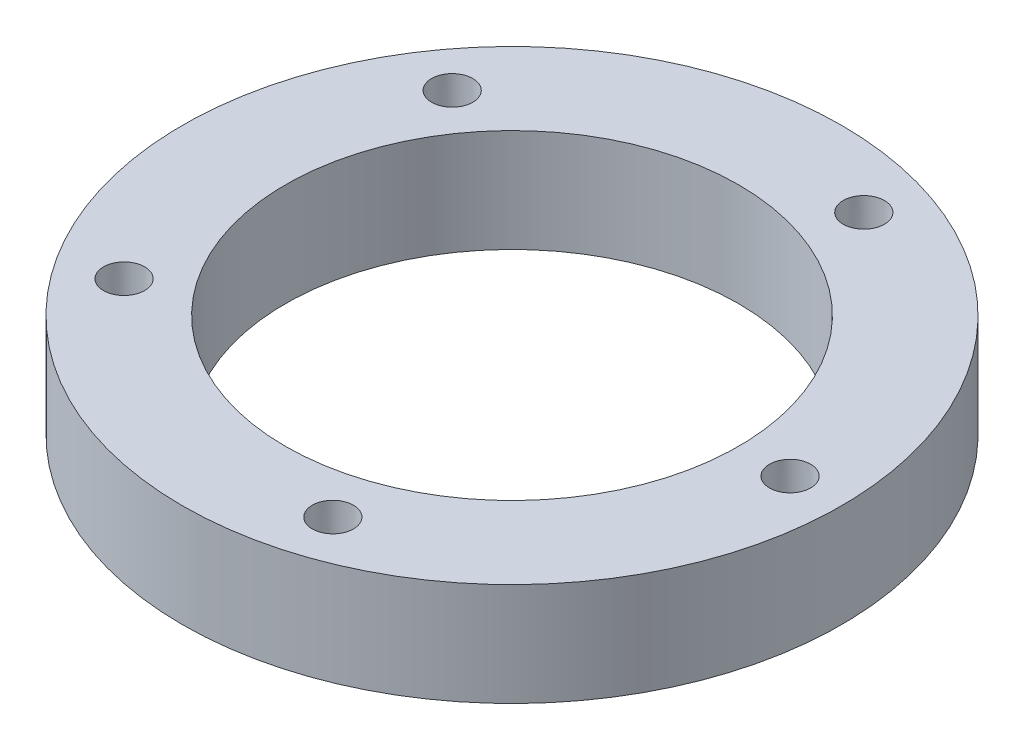
ISO-10303-21;
HEADER;
FILE_DESCRIPTION(('STEP AP214'),'2;1');
FILE_NAME('part.step','',(''),(''),'','','');
FILE_SCHEMA(('AUTOMOTIVE_DESIGN { 1 0 10303 214 1 1 1 1 }'));
ENDSEC;
DATA;
#1=APPLICATION_CONTEXT('core data for automotive mechanical design processes');
#2=APPLICATION_PROTOCOL_DEFINITION('international standard','automotive_design',2000,#1);
#3=PRODUCT_CONTEXT('',#1,'mechanical');
#4=PRODUCT('Part','Part','',(#3));
#5=PRODUCT_RELATED_PRODUCT_CATEGORY('part','',(#4));
#6=PRODUCT_DEFINITION_FORMATION('','',#4);
#7=PRODUCT_DEFINITION_CONTEXT('part definition',#1,'design');
#8=PRODUCT_DEFINITION('design','',#6,#7);
#9=PRODUCT_DEFINITION_SHAPE('','',#8);
#10=(LENGTH_UNIT() NAMED_UNIT(*) SI_UNIT(.MILLI.,.METRE.));
#11=(NAMED_UNIT(*) PLANE_ANGLE_UNIT() SI_UNIT($,.RADIAN.));
#12=(NAMED_UNIT(*) SI_UNIT($,.STERADIAN.) SOLID_ANGLE_UNIT());
#13=UNCERTAINTY_MEASURE_WITH_UNIT(LENGTH_MEASURE(1.E-05),#10,'distance_accuracy_value','');
#14=(GEOMETRIC_REPRESENTATION_CONTEXT(3) GLOBAL_UNCERTAINTY_ASSIGNED_CONTEXT((#13)) GLOBAL_UNIT_ASSIGNED_CONTEXT((#10,
#11,#12)) REPRESENTATION_CONTEXT('',''));
#15=CARTESIAN_POINT('',(0.,0.,0.));
#16=DIRECTION('',(0.,0.,1.));
#17=DIRECTION('',(1.,0.,0.));
#18=AXIS2_PLACEMENT_3D('',#15,#16,#17);
#19=CARTESIAN_POINT('',(0.,5.,0.));
#20=DIRECTION('',(0.,1.,0.));
#21=DIRECTION('',(0.,0.,1.));
#22=AXIS2_PLACEMENT_3D('',#19,#20,#21);
#23=PLANE('',#22);
#24=CARTESIAN_POINT('',(4.20236786651394,5.,-12.8780684891296));
#25=DIRECTION('',(0.,1.,0.));
#26=DIRECTION('',(0.,0.,1.));
#27=AXIS2_PLACEMENT_3D('',#24,#25,#26);
#28=CIRCLE('',#27,1.);
#29=CARTESIAN_POINT('',(4.20236786651394,5.,-11.8780684891296));
#30=VERTEX_POINT('',#29);
#31=EDGE_CURVE('E62',#30,#30,#28,.T.);
#32=ORIENTED_EDGE('',*,*,#31,.F.);
#33=EDGE_LOOP('',(#32));
#34=FACE_BOUND('',#33,.T.);
#35=CARTESIAN_POINT('',(13.5,5.,0.));
#36=DIRECTION('',(0.,1.,0.));
#37=DIRECTION('',(0.,0.,1.));
#38=AXIS2_PLACEMENT_3D('',#35,#36,#37);
#39=CIRCLE('',#38,1.);
#40=CARTESIAN_POINT('',(13.5,5.,1.));
#41=VERTEX_POINT('',#40);
#42=EDGE_CURVE('E61',#41,#41,#39,.T.);
#43=ORIENTED_EDGE('',*,*,#42,.F.);
#44=EDGE_LOOP('',(#43));
#45=FACE_BOUND('',#44,.T.);
#46=CARTESIAN_POINT('',(4.12535538281185,5.,12.8221156445327));
#47=DIRECTION('',(0.,1.,0.));
#48=DIRECTION('',(0.,0.,1.));
#49=AXIS2_PLACEMENT_3D('',#46,#47,#48);
#50=CIRCLE('',#49,1.);
#51=CARTESIAN_POINT('',(4.12535538281185,5.,13.8221156445327));
#52=VERTEX_POINT('',#51);
#53=EDGE_CURVE('E68',#52,#52,#50,.T.);
#54=ORIENTED_EDGE('',*,*,#53,.F.);
#55=EDGE_LOOP('',(#54));
#56=FACE_BOUND('',#55,.T.);
#57=CARTESIAN_POINT('',(-10.9661257565477,5.,7.86855043140605));
#58=DIRECTION('',(0.,1.,0.));
#59=DIRECTION('',(0.,0.,1.));
#60=AXIS2_PLACEMENT_3D('',#57,#58,#59);
#61=CIRCLE('',#60,1.);
#62=CARTESIAN_POINT('',(-10.9661257565477,5.,8.86855043140606));
#63=VERTEX_POINT('',#62);
#64=EDGE_CURVE('E74',#63,#63,#61,.T.);
#65=ORIENTED_EDGE('',*,*,#64,.F.);
#66=EDGE_LOOP('',(#65));
#67=FACE_BOUND('',#66,.T.);
#68=CARTESIAN_POINT('',(-10.9185294240618,5.,-8.01503688032796));
#69=DIRECTION('',(0.,1.,0.));
#70=DIRECTION('',(0.,0.,1.));
#71=AXIS2_PLACEMENT_3D('',#68,#69,#70);
#72=CIRCLE('',#71,1.);
#73=CARTESIAN_POINT('',(-10.9185294240618,5.,-7.01503688032796));
#74=VERTEX_POINT('',#73);
#75=EDGE_CURVE('E54',#74,#74,#72,.T.);
#76=ORIENTED_EDGE('',*,*,#75,.F.);
#77=EDGE_LOOP('',(#76));
#78=FACE_BOUND('',#77,.T.);
#79=CARTESIAN_POINT('',(0.,5.,0.));
#80=DIRECTION('',(0.,1.,0.));
#81=DIRECTION('',(0.,0.,1.));
#82=AXIS2_PLACEMENT_3D('',#79,#80,#81);
#83=CIRCLE('',#82,16.);
#84=CARTESIAN_POINT('',(0.,5.,16.));
#85=VERTEX_POINT('',#84);
#86=EDGE_CURVE('E10',#85,#85,#83,.T.);
#87=ORIENTED_EDGE('',*,*,#86,.T.);
#88=EDGE_LOOP('',(#87));
#89=FACE_BOUND('',#88,.T.);
#90=CARTESIAN_POINT('',(0.,5.,0.));
#91=DIRECTION('',(0.,1.,0.));
#92=DIRECTION('',(0.,0.,1.));
#93=AXIS2_PLACEMENT_3D('',#90,#91,#92);
#94=CIRCLE('',#93,11.);
#95=CARTESIAN_POINT('',(0.,5.,11.));
#96=VERTEX_POINT('',#95);
#97=EDGE_CURVE('E44',#96,#96,#94,.T.);
#98=ORIENTED_EDGE('',*,*,#97,.F.);
#99=EDGE_LOOP('',(#98));
#100=FACE_BOUND('',#99,.T.);
#101=ADVANCED_FACE('F33',(#34,#45,#56,#67,#78,#89,#100),#23,.T.);
#102=CARTESIAN_POINT('',(0.,0.,0.));
#103=DIRECTION('',(0.,1.,0.));
#104=DIRECTION('',(0.,0.,1.));
#105=AXIS2_PLACEMENT_3D('',#102,#103,#104);
#106=PLANE('',#105);
#107=CARTESIAN_POINT('',(4.20236786651394,0.,-12.8780684891296));
#108=DIRECTION('',(0.,1.,0.));
#109=DIRECTION('',(0.,0.,1.));
#110=AXIS2_PLACEMENT_3D('',#107,#108,#109);
#111=CIRCLE('',#110,0.825396152541262);
#112=CARTESIAN_POINT('',(4.20236786651394,0.,-12.0526723365883));
#113=VERTEX_POINT('',#112);
#114=EDGE_CURVE('E58',#113,#113,#111,.T.);
#115=ORIENTED_EDGE('',*,*,#114,.T.);
#116=EDGE_LOOP('',(#115));
#117=FACE_BOUND('',#116,.T.);
#118=CARTESIAN_POINT('',(13.5,0.,0.));
#119=DIRECTION('',(0.,1.,0.));
#120=DIRECTION('',(0.,0.,1.));
#121=AXIS2_PLACEMENT_3D('',#118,#119,#120);
#122=CIRCLE('',#121,0.825396152541262);
#123=CARTESIAN_POINT('',(13.5,0.,0.825396152541262));
#124=VERTEX_POINT('',#123);
#125=EDGE_CURVE('E65',#124,#124,#122,.T.);
#126=ORIENTED_EDGE('',*,*,#125,.T.);
#127=EDGE_LOOP('',(#126));
#128=FACE_BOUND('',#127,.T.);
#129=CARTESIAN_POINT('',(4.12535538281185,0.,12.8221156445327));
#130=DIRECTION('',(0.,1.,0.));
#131=DIRECTION('',(0.,0.,1.));
#132=AXIS2_PLACEMENT_3D('',#129,#130,#131);
#133=CIRCLE('',#132,0.825396152541264);
#134=CARTESIAN_POINT('',(4.12535538281185,0.,13.6475117970739));
#135=VERTEX_POINT('',#134);
#136=EDGE_CURVE('E71',#135,#135,#133,.T.);
#137=ORIENTED_EDGE('',*,*,#136,.T.);
#138=EDGE_LOOP('',(#137));
#139=FACE_BOUND('',#138,.T.);
#140=CARTESIAN_POINT('',(-10.9661257565477,0.,7.86855043140605));
#141=DIRECTION('',(0.,1.,0.));
#142=DIRECTION('',(0.,0.,1.));
#143=AXIS2_PLACEMENT_3D('',#140,#141,#142);
#144=CIRCLE('',#143,0.825396152541262);
#145=CARTESIAN_POINT('',(-10.9661257565477,0.,8.69394658394732));
#146=VERTEX_POINT('',#145);
#147=EDGE_CURVE('E57',#146,#146,#144,.T.);
#148=ORIENTED_EDGE('',*,*,#147,.T.);
#149=EDGE_LOOP('',(#148));
#150=FACE_BOUND('',#149,.T.);
#151=CARTESIAN_POINT('',(-10.9185294240618,0.,-8.01503688032796));
#152=DIRECTION('',(0.,1.,0.));
#153=DIRECTION('',(0.,0.,1.));
#154=AXIS2_PLACEMENT_3D('',#151,#152,#153);
#155=CIRCLE('',#154,0.825396152541263);
#156=CARTESIAN_POINT('',(-10.9185294240618,0.,-7.1896407277867));
#157=VERTEX_POINT('',#156);
#158=EDGE_CURVE('E49',#157,#157,#155,.T.);
#159=ORIENTED_EDGE('',*,*,#158,.T.);
#160=EDGE_LOOP('',(#159));
#161=FACE_BOUND('',#160,.T.);
#162=CARTESIAN_POINT('',(0.,0.,0.));
#163=DIRECTION('',(0.,1.,0.));
#164=DIRECTION('',(0.,0.,1.));
#165=AXIS2_PLACEMENT_3D('',#162,#163,#164);
#166=CIRCLE('',#165,16.);
#167=CARTESIAN_POINT('',(0.,0.,16.));
#168=VERTEX_POINT('',#167);
#169=EDGE_CURVE('E37',#168,#168,#166,.T.);
#170=ORIENTED_EDGE('',*,*,#169,.F.);
#171=EDGE_LOOP('',(#170));
#172=FACE_BOUND('',#171,.T.);
#173=CARTESIAN_POINT('',(0.,0.,0.));
#174=DIRECTION('',(0.,1.,0.));
#175=DIRECTION('',(0.,0.,1.));
#176=AXIS2_PLACEMENT_3D('',#173,#174,#175);
#177=CIRCLE('',#176,11.);
#178=CARTESIAN_POINT('',(0.,0.,11.));
#179=VERTEX_POINT('',#178);
#180=EDGE_CURVE('E46',#179,#179,#177,.T.);
#181=ORIENTED_EDGE('',*,*,#180,.T.);
#182=EDGE_LOOP('',(#181));
#183=FACE_BOUND('',#182,.T.);
#184=ADVANCED_FACE('F86',(#117,#128,#139,#150,#161,#172,#183),#106,.F.);
#185=CARTESIAN_POINT('',(0.,5.,0.));
#186=DIRECTION('',(0.,-1.,0.));
#187=DIRECTION('',(0.,0.,-1.));
#188=AXIS2_PLACEMENT_3D('',#185,#186,#187);
#189=CYLINDRICAL_SURFACE('',#188,16.);
#190=ORIENTED_EDGE('',*,*,#86,.F.);
#191=EDGE_LOOP('',(#190));
#192=FACE_BOUND('',#191,.T.);
#193=ORIENTED_EDGE('',*,*,#169,.T.);
#194=EDGE_LOOP('',(#193));
#195=FACE_BOUND('',#194,.T.);
#196=ADVANCED_FACE('F35',(#192,#195),#189,.T.);
#197=CARTESIAN_POINT('',(0.,5.,0.));
#198=DIRECTION('',(0.,-1.,0.));
#199=DIRECTION('',(0.,0.,-1.));
#200=AXIS2_PLACEMENT_3D('',#197,#198,#199);
#201=CYLINDRICAL_SURFACE('',#200,11.);
#202=ORIENTED_EDGE('',*,*,#97,.T.);
#203=EDGE_LOOP('',(#202));
#204=FACE_BOUND('',#203,.T.);
#205=ORIENTED_EDGE('',*,*,#180,.F.);
#206=EDGE_LOOP('',(#205));
#207=FACE_BOUND('',#206,.T.);
#208=ADVANCED_FACE('F93',(#204,#207),#201,.F.);
#209=CARTESIAN_POINT('',(-10.9185294240618,5.,-8.01503688032796));
#210=DIRECTION('',(0.,1.,0.));
#211=DIRECTION('',(0.,0.,1.));
#212=AXIS2_PLACEMENT_3D('',#209,#210,#211);
#213=CONICAL_SURFACE('',#212,1.,0.0349065850398867);
#214=ORIENTED_EDGE('',*,*,#158,.F.);
#215=EDGE_LOOP('',(#214));
#216=FACE_BOUND('',#215,.T.);
#217=ORIENTED_EDGE('',*,*,#75,.T.);
#218=EDGE_LOOP('',(#217));
#219=FACE_BOUND('',#218,.T.);
#220=ADVANCED_FACE('F96',(#216,#219),#213,.F.);
#221=CARTESIAN_POINT('',(-10.9661257565477,5.,7.86855043140605));
#222=DIRECTION('',(0.,1.,0.));
#223=DIRECTION('',(0.,0.,1.));
#224=AXIS2_PLACEMENT_3D('',#221,#222,#223);
#225=CONICAL_SURFACE('',#224,1.,0.0349065850398867);
#226=ORIENTED_EDGE('',*,*,#147,.F.);
#227=EDGE_LOOP('',(#226));
#228=FACE_BOUND('',#227,.T.);
#229=ORIENTED_EDGE('',*,*,#64,.T.);
#230=EDGE_LOOP('',(#229));
#231=FACE_BOUND('',#230,.T.);
#232=ADVANCED_FACE('F82',(#228,#231),#225,.F.);
#233=CARTESIAN_POINT('',(4.12535538281185,5.,12.8221156445327));
#234=DIRECTION('',(0.,1.,0.));
#235=DIRECTION('',(0.,0.,1.));
#236=AXIS2_PLACEMENT_3D('',#233,#234,#235);
#237=CONICAL_SURFACE('',#236,1.,0.0349065850398867);
#238=ORIENTED_EDGE('',*,*,#136,.F.);
#239=EDGE_LOOP('',(#238));
#240=FACE_BOUND('',#239,.T.);
#241=ORIENTED_EDGE('',*,*,#53,.T.);
#242=EDGE_LOOP('',(#241));
#243=FACE_BOUND('',#242,.T.);
#244=ADVANCED_FACE('F118',(#240,#243),#237,.F.);
#245=CARTESIAN_POINT('',(13.5,5.,0.));
#246=DIRECTION('',(0.,1.,0.));
#247=DIRECTION('',(0.,0.,1.));
#248=AXIS2_PLACEMENT_3D('',#245,#246,#247);
#249=CONICAL_SURFACE('',#248,1.,0.0349065850398867);
#250=ORIENTED_EDGE('',*,*,#125,.F.);
#251=EDGE_LOOP('',(#250));
#252=FACE_BOUND('',#251,.T.);
#253=ORIENTED_EDGE('',*,*,#42,.T.);
#254=EDGE_LOOP('',(#253));
#255=FACE_BOUND('',#254,.T.);
#256=ADVANCED_FACE('F114',(#252,#255),#249,.F.);
#257=CARTESIAN_POINT('',(4.20236786651394,5.,-12.8780684891296));
#258=DIRECTION('',(0.,1.,0.));
#259=DIRECTION('',(0.,0.,1.));
#260=AXIS2_PLACEMENT_3D('',#257,#258,#259);
#261=CONICAL_SURFACE('',#260,1.,0.0349065850398867);
#262=ORIENTED_EDGE('',*,*,#114,.F.);
#263=EDGE_LOOP('',(#262));
#264=FACE_BOUND('',#263,.T.);
#265=ORIENTED_EDGE('',*,*,#31,.T.);
#266=EDGE_LOOP('',(#265));
#267=FACE_BOUND('',#266,.T.);
#268=ADVANCED_FACE('F111',(#264,#267),#261,.F.);
#269=CLOSED_SHELL('',(#101,#184,#196,#208,#220,#232,#244,#256,#268));
#270=MANIFOLD_SOLID_BREP('B2',#269);
#271=ADVANCED_BREP_SHAPE_REPRESENTATION('',(#18,#270),#14);
#272=SHAPE_DEFINITION_REPRESENTATION(#9,#271);
ENDSEC;
END-ISO-10303-21;
